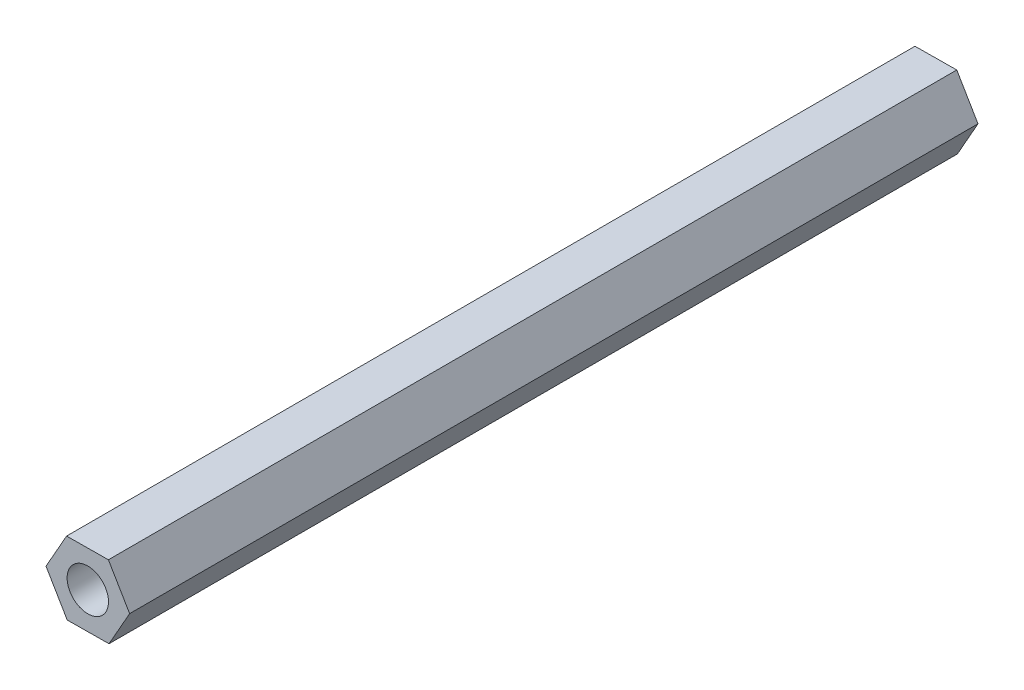
ISO-10303-21;
HEADER;
FILE_DESCRIPTION(('STEP AP214'),'2;1');
FILE_NAME('part.step','',(''),(''),'','','');
FILE_SCHEMA(('AUTOMOTIVE_DESIGN { 1 0 10303 214 1 1 1 1 }'));
ENDSEC;
DATA;
#1=APPLICATION_CONTEXT('core data for automotive mechanical design processes');
#2=APPLICATION_PROTOCOL_DEFINITION('international standard','automotive_design',2000,#1);
#3=PRODUCT_CONTEXT('',#1,'mechanical');
#4=PRODUCT('Part','Part','',(#3));
#5=PRODUCT_RELATED_PRODUCT_CATEGORY('part','',(#4));
#6=PRODUCT_DEFINITION_FORMATION('','',#4);
#7=PRODUCT_DEFINITION_CONTEXT('part definition',#1,'design');
#8=PRODUCT_DEFINITION('design','',#6,#7);
#9=PRODUCT_DEFINITION_SHAPE('','',#8);
#10=(LENGTH_UNIT() NAMED_UNIT(*) SI_UNIT(.MILLI.,.METRE.));
#11=(NAMED_UNIT(*) PLANE_ANGLE_UNIT() SI_UNIT($,.RADIAN.));
#12=(NAMED_UNIT(*) SI_UNIT($,.STERADIAN.) SOLID_ANGLE_UNIT());
#13=UNCERTAINTY_MEASURE_WITH_UNIT(LENGTH_MEASURE(1.E-05),#10,'distance_accuracy_value','');
#14=(GEOMETRIC_REPRESENTATION_CONTEXT(3) GLOBAL_UNCERTAINTY_ASSIGNED_CONTEXT((#13)) GLOBAL_UNIT_ASSIGNED_CONTEXT((#10,
#11,#12)) REPRESENTATION_CONTEXT('',''));
#15=CARTESIAN_POINT('',(0.,0.,0.));
#16=DIRECTION('',(0.,0.,1.));
#17=DIRECTION('',(1.,0.,0.));
#18=AXIS2_PLACEMENT_3D('',#15,#16,#17);
#19=CARTESIAN_POINT('',(0.,0.,82.));
#20=DIRECTION('',(0.,0.,1.));
#21=DIRECTION('',(1.,0.,0.));
#22=AXIS2_PLACEMENT_3D('',#19,#20,#21);
#23=PLANE('',#22);
#24=DIRECTION('',(0.999961257640527,0.00880245522430722,0.));
#25=VECTOR('',#24,1.);
#26=CARTESIAN_POINT('',(-1.98983906118775,-3.51765175136834,82.));
#27=LINE('',#26,#25);
#28=CARTESIAN_POINT('',(-1.98983906118775,-3.51765175136834,82.));
#29=VERTEX_POINT('',#28);
#30=CARTESIAN_POINT('',(2.05145624775792,-3.48207705211536,82.));
#31=VERTEX_POINT('',#30);
#32=EDGE_CURVE('E131',#29,#31,#27,.T.);
#33=ORIENTED_EDGE('',*,*,#32,.T.);
#34=DIRECTION('',(0.492357478980338,0.870393079529086,0.));
#35=VECTOR('',#34,1.);
#36=CARTESIAN_POINT('',(2.05145624775792,-3.48207705211536,82.));
#37=LINE('',#36,#35);
#38=CARTESIAN_POINT('',(4.04129530894568,0.0355746992529791,82.));
#39=VERTEX_POINT('',#38);
#40=EDGE_CURVE('E89',#31,#39,#37,.T.);
#41=ORIENTED_EDGE('',*,*,#40,.T.);
#42=DIRECTION('',(-0.507603778660189,0.861590624304779,0.));
#43=VECTOR('',#42,1.);
#44=CARTESIAN_POINT('',(4.04129530894568,0.0355746992529791,82.));
#45=LINE('',#44,#43);
#46=CARTESIAN_POINT('',(1.98983906118776,3.51765175136834,82.));
#47=VERTEX_POINT('',#46);
#48=EDGE_CURVE('E102',#39,#47,#45,.T.);
#49=ORIENTED_EDGE('',*,*,#48,.T.);
#50=DIRECTION('',(-0.999961257640527,-0.00880245522430723,0.));
#51=VECTOR('',#50,1.);
#52=CARTESIAN_POINT('',(1.98983906118776,3.51765175136834,82.));
#53=LINE('',#52,#51);
#54=CARTESIAN_POINT('',(-2.05145624775791,3.48207705211536,82.));
#55=VERTEX_POINT('',#54);
#56=EDGE_CURVE('E96',#47,#55,#53,.T.);
#57=ORIENTED_EDGE('',*,*,#56,.T.);
#58=DIRECTION('',(-0.492357478980338,-0.870393079529086,0.));
#59=VECTOR('',#58,1.);
#60=CARTESIAN_POINT('',(-2.05145624775791,3.48207705211536,82.));
#61=LINE('',#60,#59);
#62=CARTESIAN_POINT('',(-4.04129530894568,-0.0355746992529825,82.));
#63=VERTEX_POINT('',#62);
#64=EDGE_CURVE('E100',#55,#63,#61,.T.);
#65=ORIENTED_EDGE('',*,*,#64,.T.);
#66=DIRECTION('',(0.507603778660189,-0.861590624304779,0.));
#67=VECTOR('',#66,1.);
#68=CARTESIAN_POINT('',(-4.04129530894568,-0.0355746992529825,82.));
#69=LINE('',#68,#67);
#70=EDGE_CURVE('E52',#63,#29,#69,.T.);
#71=ORIENTED_EDGE('',*,*,#70,.T.);
#72=EDGE_LOOP('',(#33,#41,#49,#57,#65,#71));
#73=FACE_BOUND('',#72,.T.);
#74=CARTESIAN_POINT('',(0.,0.,82.));
#75=DIRECTION('',(0.,0.,1.));
#76=DIRECTION('',(1.,0.,0.));
#77=AXIS2_PLACEMENT_3D('',#74,#75,#76);
#78=CIRCLE('',#77,2.);
#79=CARTESIAN_POINT('',(2.,0.,82.));
#80=VERTEX_POINT('',#79);
#81=EDGE_CURVE('E124',#80,#80,#78,.T.);
#82=ORIENTED_EDGE('',*,*,#81,.F.);
#83=EDGE_LOOP('',(#82));
#84=FACE_BOUND('',#83,.T.);
#85=ADVANCED_FACE('F35',(#73,#84),#23,.T.);
#86=CARTESIAN_POINT('',(0.,0.,0.));
#87=DIRECTION('',(0.,0.,1.));
#88=DIRECTION('',(1.,0.,0.));
#89=AXIS2_PLACEMENT_3D('',#86,#87,#88);
#90=PLANE('',#89);
#91=DIRECTION('',(0.999961257640527,0.00880245522430722,0.));
#92=VECTOR('',#91,1.);
#93=CARTESIAN_POINT('',(-1.98983906118775,-3.51765175136834,0.));
#94=LINE('',#93,#92);
#95=CARTESIAN_POINT('',(-1.98983906118775,-3.51765175136834,0.));
#96=VERTEX_POINT('',#95);
#97=CARTESIAN_POINT('',(2.05145624775792,-3.48207705211536,0.));
#98=VERTEX_POINT('',#97);
#99=EDGE_CURVE('E120',#96,#98,#94,.T.);
#100=ORIENTED_EDGE('',*,*,#99,.F.);
#101=DIRECTION('',(0.507603778660189,-0.861590624304779,0.));
#102=VECTOR('',#101,1.);
#103=CARTESIAN_POINT('',(-4.04129530894568,-0.0355746992529825,0.));
#104=LINE('',#103,#102);
#105=CARTESIAN_POINT('',(-4.04129530894568,-0.0355746992529825,0.));
#106=VERTEX_POINT('',#105);
#107=EDGE_CURVE('E81',#106,#96,#104,.T.);
#108=ORIENTED_EDGE('',*,*,#107,.F.);
#109=DIRECTION('',(-0.492357478980338,-0.870393079529086,0.));
#110=VECTOR('',#109,1.);
#111=CARTESIAN_POINT('',(-2.05145624775791,3.48207705211536,0.));
#112=LINE('',#111,#110);
#113=CARTESIAN_POINT('',(-2.05145624775791,3.48207705211536,0.));
#114=VERTEX_POINT('',#113);
#115=EDGE_CURVE('E75',#114,#106,#112,.T.);
#116=ORIENTED_EDGE('',*,*,#115,.F.);
#117=DIRECTION('',(-0.999961257640527,-0.00880245522430723,0.));
#118=VECTOR('',#117,1.);
#119=CARTESIAN_POINT('',(1.98983906118776,3.51765175136834,0.));
#120=LINE('',#119,#118);
#121=CARTESIAN_POINT('',(1.98983906118776,3.51765175136834,0.));
#122=VERTEX_POINT('',#121);
#123=EDGE_CURVE('E110',#122,#114,#120,.T.);
#124=ORIENTED_EDGE('',*,*,#123,.F.);
#125=DIRECTION('',(-0.507603778660189,0.861590624304779,0.));
#126=VECTOR('',#125,1.);
#127=CARTESIAN_POINT('',(4.04129530894568,0.0355746992529791,0.));
#128=LINE('',#127,#126);
#129=CARTESIAN_POINT('',(4.04129530894568,0.0355746992529791,0.));
#130=VERTEX_POINT('',#129);
#131=EDGE_CURVE('E126',#130,#122,#128,.T.);
#132=ORIENTED_EDGE('',*,*,#131,.F.);
#133=DIRECTION('',(0.492357478980338,0.870393079529086,0.));
#134=VECTOR('',#133,1.);
#135=CARTESIAN_POINT('',(2.05145624775792,-3.48207705211536,0.));
#136=LINE('',#135,#134);
#137=EDGE_CURVE('E123',#98,#130,#136,.T.);
#138=ORIENTED_EDGE('',*,*,#137,.F.);
#139=EDGE_LOOP('',(#100,#108,#116,#124,#132,#138));
#140=FACE_BOUND('',#139,.T.);
#141=CARTESIAN_POINT('',(0.,0.,0.));
#142=DIRECTION('',(0.,0.,1.));
#143=DIRECTION('',(1.,0.,0.));
#144=AXIS2_PLACEMENT_3D('',#141,#142,#143);
#145=CIRCLE('',#144,2.);
#146=CARTESIAN_POINT('',(2.,0.,0.));
#147=VERTEX_POINT('',#146);
#148=EDGE_CURVE('E224',#147,#147,#145,.T.);
#149=ORIENTED_EDGE('',*,*,#148,.T.);
#150=EDGE_LOOP('',(#149));
#151=FACE_BOUND('',#150,.T.);
#152=ADVANCED_FACE('F140',(#140,#151),#90,.F.);
#153=CARTESIAN_POINT('',(-1.98983906118775,-3.51765175136834,82.));
#154=DIRECTION('',(-0.00880245522430722,0.999961257640527,0.));
#155=DIRECTION('',(-0.999961257640527,-0.00880245522430722,0.));
#156=AXIS2_PLACEMENT_3D('',#153,#154,#155);
#157=PLANE('',#156);
#158=ORIENTED_EDGE('',*,*,#99,.T.);
#159=DIRECTION('',(0.,0.,-1.));
#160=VECTOR('',#159,1.);
#161=CARTESIAN_POINT('',(2.05145624775792,-3.48207705211536,82.));
#162=LINE('',#161,#160);
#163=EDGE_CURVE('E11',#31,#98,#162,.T.);
#164=ORIENTED_EDGE('',*,*,#163,.F.);
#165=ORIENTED_EDGE('',*,*,#32,.F.);
#166=DIRECTION('',(0.,0.,-1.));
#167=VECTOR('',#166,1.);
#168=CARTESIAN_POINT('',(-1.98983906118775,-3.51765175136834,82.));
#169=LINE('',#168,#167);
#170=EDGE_CURVE('E116',#29,#96,#169,.T.);
#171=ORIENTED_EDGE('',*,*,#170,.T.);
#172=EDGE_LOOP('',(#158,#164,#165,#171));
#173=FACE_BOUND('',#172,.T.);
#174=ADVANCED_FACE('F37',(#173),#157,.F.);
#175=CARTESIAN_POINT('',(2.05145624775792,-3.48207705211536,82.));
#176=DIRECTION('',(-0.870393079529086,0.492357478980338,0.));
#177=DIRECTION('',(-0.492357478980338,-0.870393079529086,0.));
#178=AXIS2_PLACEMENT_3D('',#175,#176,#177);
#179=PLANE('',#178);
#180=ORIENTED_EDGE('',*,*,#137,.T.);
#181=DIRECTION('',(0.,0.,-1.));
#182=VECTOR('',#181,1.);
#183=CARTESIAN_POINT('',(4.04129530894568,0.0355746992529791,82.));
#184=LINE('',#183,#182);
#185=EDGE_CURVE('E44',#39,#130,#184,.T.);
#186=ORIENTED_EDGE('',*,*,#185,.F.);
#187=ORIENTED_EDGE('',*,*,#40,.F.);
#188=ORIENTED_EDGE('',*,*,#163,.T.);
#189=EDGE_LOOP('',(#180,#186,#187,#188));
#190=FACE_BOUND('',#189,.T.);
#191=ADVANCED_FACE('F165',(#190),#179,.F.);
#192=CARTESIAN_POINT('',(4.04129530894568,0.0355746992529791,82.));
#193=DIRECTION('',(-0.861590624304779,-0.507603778660189,0.));
#194=DIRECTION('',(0.507603778660189,-0.861590624304779,0.));
#195=AXIS2_PLACEMENT_3D('',#192,#193,#194);
#196=PLANE('',#195);
#197=ORIENTED_EDGE('',*,*,#131,.T.);
#198=DIRECTION('',(0.,0.,-1.));
#199=VECTOR('',#198,1.);
#200=CARTESIAN_POINT('',(1.98983906118776,3.51765175136834,82.));
#201=LINE('',#200,#199);
#202=EDGE_CURVE('E111',#47,#122,#201,.T.);
#203=ORIENTED_EDGE('',*,*,#202,.F.);
#204=ORIENTED_EDGE('',*,*,#48,.F.);
#205=ORIENTED_EDGE('',*,*,#185,.T.);
#206=EDGE_LOOP('',(#197,#203,#204,#205));
#207=FACE_BOUND('',#206,.T.);
#208=ADVANCED_FACE('F137',(#207),#196,.F.);
#209=CARTESIAN_POINT('',(1.98983906118776,3.51765175136834,82.));
#210=DIRECTION('',(0.00880245522430723,-0.999961257640527,0.));
#211=DIRECTION('',(0.999961257640527,0.00880245522430723,0.));
#212=AXIS2_PLACEMENT_3D('',#209,#210,#211);
#213=PLANE('',#212);
#214=ORIENTED_EDGE('',*,*,#123,.T.);
#215=DIRECTION('',(0.,0.,-1.));
#216=VECTOR('',#215,1.);
#217=CARTESIAN_POINT('',(-2.05145624775791,3.48207705211536,82.));
#218=LINE('',#217,#216);
#219=EDGE_CURVE('E107',#55,#114,#218,.T.);
#220=ORIENTED_EDGE('',*,*,#219,.F.);
#221=ORIENTED_EDGE('',*,*,#56,.F.);
#222=ORIENTED_EDGE('',*,*,#202,.T.);
#223=EDGE_LOOP('',(#214,#220,#221,#222));
#224=FACE_BOUND('',#223,.T.);
#225=ADVANCED_FACE('F108',(#224),#213,.F.);
#226=CARTESIAN_POINT('',(-2.05145624775791,3.48207705211536,82.));
#227=DIRECTION('',(0.870393079529086,-0.492357478980338,0.));
#228=DIRECTION('',(0.492357478980338,0.870393079529086,0.));
#229=AXIS2_PLACEMENT_3D('',#226,#227,#228);
#230=PLANE('',#229);
#231=ORIENTED_EDGE('',*,*,#115,.T.);
#232=DIRECTION('',(0.,0.,-1.));
#233=VECTOR('',#232,1.);
#234=CARTESIAN_POINT('',(-4.04129530894568,-0.0355746992529825,82.));
#235=LINE('',#234,#233);
#236=EDGE_CURVE('E112',#63,#106,#235,.T.);
#237=ORIENTED_EDGE('',*,*,#236,.F.);
#238=ORIENTED_EDGE('',*,*,#64,.F.);
#239=ORIENTED_EDGE('',*,*,#219,.T.);
#240=EDGE_LOOP('',(#231,#237,#238,#239));
#241=FACE_BOUND('',#240,.T.);
#242=ADVANCED_FACE('F114',(#241),#230,.F.);
#243=CARTESIAN_POINT('',(-4.04129530894568,-0.0355746992529825,82.));
#244=DIRECTION('',(0.861590624304779,0.507603778660189,0.));
#245=DIRECTION('',(-0.507603778660189,0.861590624304779,0.));
#246=AXIS2_PLACEMENT_3D('',#243,#244,#245);
#247=PLANE('',#246);
#248=ORIENTED_EDGE('',*,*,#107,.T.);
#249=ORIENTED_EDGE('',*,*,#170,.F.);
#250=ORIENTED_EDGE('',*,*,#70,.F.);
#251=ORIENTED_EDGE('',*,*,#236,.T.);
#252=EDGE_LOOP('',(#248,#249,#250,#251));
#253=FACE_BOUND('',#252,.T.);
#254=ADVANCED_FACE('F145',(#253),#247,.F.);
#255=CARTESIAN_POINT('',(0.,0.,82.));
#256=DIRECTION('',(0.,0.,-1.));
#257=DIRECTION('',(-1.,0.,0.));
#258=AXIS2_PLACEMENT_3D('',#255,#256,#257);
#259=CYLINDRICAL_SURFACE('',#258,2.);
#260=ORIENTED_EDGE('',*,*,#81,.T.);
#261=EDGE_LOOP('',(#260));
#262=FACE_BOUND('',#261,.T.);
#263=ORIENTED_EDGE('',*,*,#148,.F.);
#264=EDGE_LOOP('',(#263));
#265=FACE_BOUND('',#264,.T.);
#266=ADVANCED_FACE('F147',(#262,#265),#259,.F.);
#267=CLOSED_SHELL('',(#85,#152,#174,#191,#208,#225,#242,#254,#266));
#268=MANIFOLD_SOLID_BREP('B2',#267);
#269=ADVANCED_BREP_SHAPE_REPRESENTATION('',(#18,#268),#14);
#270=SHAPE_DEFINITION_REPRESENTATION(#9,#269);
ENDSEC;
END-ISO-10303-21;
